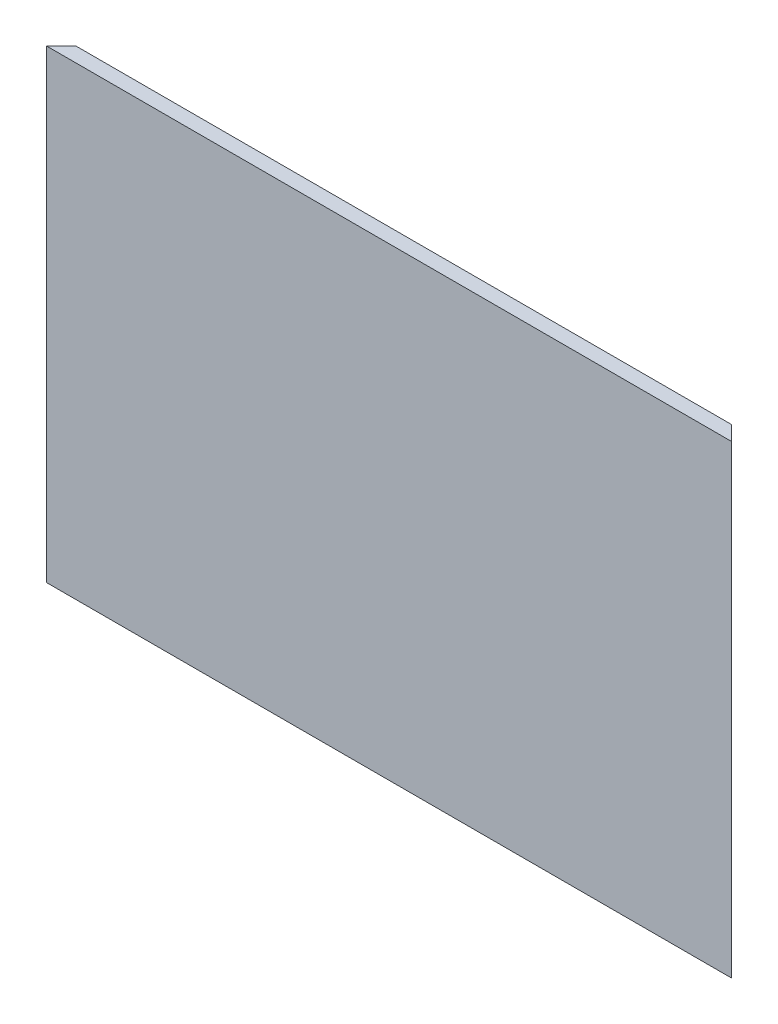
ISO-10303-21;
HEADER;
FILE_DESCRIPTION(('STEP AP214'),'2;1');
FILE_NAME('part.step','',(''),(''),'','','');
FILE_SCHEMA(('AUTOMOTIVE_DESIGN { 1 0 10303 214 1 1 1 1 }'));
ENDSEC;
DATA;
#1=APPLICATION_CONTEXT('core data for automotive mechanical design processes');
#2=APPLICATION_PROTOCOL_DEFINITION('international standard','automotive_design',2000,#1);
#3=PRODUCT_CONTEXT('',#1,'mechanical');
#4=PRODUCT('Part','Part','',(#3));
#5=PRODUCT_RELATED_PRODUCT_CATEGORY('part','',(#4));
#6=PRODUCT_DEFINITION_FORMATION('','',#4);
#7=PRODUCT_DEFINITION_CONTEXT('part definition',#1,'design');
#8=PRODUCT_DEFINITION('design','',#6,#7);
#9=PRODUCT_DEFINITION_SHAPE('','',#8);
#10=(LENGTH_UNIT() NAMED_UNIT(*) SI_UNIT(.MILLI.,.METRE.));
#11=(NAMED_UNIT(*) PLANE_ANGLE_UNIT() SI_UNIT($,.RADIAN.));
#12=(NAMED_UNIT(*) SI_UNIT($,.STERADIAN.) SOLID_ANGLE_UNIT());
#13=UNCERTAINTY_MEASURE_WITH_UNIT(LENGTH_MEASURE(1.E-05),#10,'distance_accuracy_value','');
#14=(GEOMETRIC_REPRESENTATION_CONTEXT(3) GLOBAL_UNCERTAINTY_ASSIGNED_CONTEXT((#13)) GLOBAL_UNIT_ASSIGNED_CONTEXT((#10,
#11,#12)) REPRESENTATION_CONTEXT('',''));
#15=CARTESIAN_POINT('',(0.,0.,0.));
#16=DIRECTION('',(0.,0.,1.));
#17=DIRECTION('',(1.,0.,0.));
#18=AXIS2_PLACEMENT_3D('',#15,#16,#17);
#19=CARTESIAN_POINT('',(70.,95.,1.49999999999999));
#20=DIRECTION('',(0.,0.,-1.));
#21=DIRECTION('',(-1.,0.,0.));
#22=AXIS2_PLACEMENT_3D('',#19,#20,#21);
#23=PLANE('',#22);
#24=DIRECTION('',(1.,0.,0.));
#25=VECTOR('',#24,1.);
#26=CARTESIAN_POINT('',(70.,0.,1.49999999999999));
#27=LINE('',#26,#25);
#28=CARTESIAN_POINT('',(-70.,0.,1.50000000000001));
#29=VERTEX_POINT('',#28);
#30=CARTESIAN_POINT('',(70.,0.,1.49999999999999));
#31=VERTEX_POINT('',#30);
#32=EDGE_CURVE('E79',#29,#31,#27,.T.);
#33=ORIENTED_EDGE('',*,*,#32,.T.);
#34=DIRECTION('',(0.,-1.,0.));
#35=VECTOR('',#34,1.);
#36=CARTESIAN_POINT('',(70.,95.,1.49999999999999));
#37=LINE('',#36,#35);
#38=CARTESIAN_POINT('',(70.,95.,1.49999999999999));
#39=VERTEX_POINT('',#38);
#40=EDGE_CURVE('E40',#39,#31,#37,.T.);
#41=ORIENTED_EDGE('',*,*,#40,.F.);
#42=DIRECTION('',(1.,0.,0.));
#43=VECTOR('',#42,1.);
#44=CARTESIAN_POINT('',(70.,95.,1.49999999999999));
#45=LINE('',#44,#43);
#46=CARTESIAN_POINT('',(-70.,95.,1.50000000000001));
#47=VERTEX_POINT('',#46);
#48=EDGE_CURVE('E88',#47,#39,#45,.T.);
#49=ORIENTED_EDGE('',*,*,#48,.F.);
#50=DIRECTION('',(0.,-1.,0.));
#51=VECTOR('',#50,1.);
#52=CARTESIAN_POINT('',(-70.,95.,1.50000000000001));
#53=LINE('',#52,#51);
#54=EDGE_CURVE('E11',#47,#29,#53,.T.);
#55=ORIENTED_EDGE('',*,*,#54,.T.);
#56=EDGE_LOOP('',(#33,#41,#49,#55));
#57=FACE_BOUND('',#56,.T.);
#58=ADVANCED_FACE('F33',(#57),#23,.F.);
#59=CARTESIAN_POINT('',(70.,95.,-1.50000000000001));
#60=DIRECTION('',(0.,0.,1.));
#61=DIRECTION('',(1.,0.,0.));
#62=AXIS2_PLACEMENT_3D('',#59,#60,#61);
#63=PLANE('',#62);
#64=DIRECTION('',(-1.,0.,0.));
#65=VECTOR('',#64,1.);
#66=CARTESIAN_POINT('',(70.,0.,-1.50000000000001));
#67=LINE('',#66,#65);
#68=CARTESIAN_POINT('',(67.,0.,-1.50000000000001));
#69=VERTEX_POINT('',#68);
#70=CARTESIAN_POINT('',(-67.,0.,-1.49999999999999));
#71=VERTEX_POINT('',#70);
#72=EDGE_CURVE('E83',#69,#71,#67,.T.);
#73=ORIENTED_EDGE('',*,*,#72,.T.);
#74=DIRECTION('',(0.,1.,0.));
#75=VECTOR('',#74,1.);
#76=CARTESIAN_POINT('',(-67.,0.,-1.50000000000001));
#77=LINE('',#76,#75);
#78=CARTESIAN_POINT('',(-67.,95.,-1.50000000000001));
#79=VERTEX_POINT('',#78);
#80=EDGE_CURVE('E47',#71,#79,#77,.T.);
#81=ORIENTED_EDGE('',*,*,#80,.T.);
#82=DIRECTION('',(-1.,0.,0.));
#83=VECTOR('',#82,1.);
#84=CARTESIAN_POINT('',(70.,95.,-1.50000000000001));
#85=LINE('',#84,#83);
#86=CARTESIAN_POINT('',(67.,95.,-1.50000000000001));
#87=VERTEX_POINT('',#86);
#88=EDGE_CURVE('E91',#87,#79,#85,.T.);
#89=ORIENTED_EDGE('',*,*,#88,.F.);
#90=DIRECTION('',(0.,1.,0.));
#91=VECTOR('',#90,1.);
#92=CARTESIAN_POINT('',(67.,0.,-1.50000000000001));
#93=LINE('',#92,#91);
#94=EDGE_CURVE('E84',#69,#87,#93,.T.);
#95=ORIENTED_EDGE('',*,*,#94,.F.);
#96=EDGE_LOOP('',(#73,#81,#89,#95));
#97=FACE_BOUND('',#96,.T.);
#98=ADVANCED_FACE('F104',(#97),#63,.F.);
#99=CARTESIAN_POINT('',(0.,95.,0.));
#100=DIRECTION('',(0.,1.,0.));
#101=DIRECTION('',(0.,0.,1.));
#102=AXIS2_PLACEMENT_3D('',#99,#100,#101);
#103=PLANE('',#102);
#104=DIRECTION('',(0.707106781186542,0.,-0.707106781186553));
#105=VECTOR('',#104,1.);
#106=CARTESIAN_POINT('',(-67.,95.,-1.50000000000001));
#107=LINE('',#106,#105);
#108=EDGE_CURVE('E76',#47,#79,#107,.T.);
#109=ORIENTED_EDGE('',*,*,#108,.F.);
#110=ORIENTED_EDGE('',*,*,#48,.T.);
#111=DIRECTION('',(0.707106781186543,0.,0.707106781186552));
#112=VECTOR('',#111,1.);
#113=CARTESIAN_POINT('',(67.,95.,-1.50000000000001));
#114=LINE('',#113,#112);
#115=EDGE_CURVE('E98',#87,#39,#114,.T.);
#116=ORIENTED_EDGE('',*,*,#115,.F.);
#117=ORIENTED_EDGE('',*,*,#88,.T.);
#118=EDGE_LOOP('',(#109,#110,#116,#117));
#119=FACE_BOUND('',#118,.T.);
#120=ADVANCED_FACE('F106',(#119),#103,.T.);
#121=CARTESIAN_POINT('',(0.,0.,0.));
#122=DIRECTION('',(0.,1.,0.));
#123=DIRECTION('',(0.,0.,1.));
#124=AXIS2_PLACEMENT_3D('',#121,#122,#123);
#125=PLANE('',#124);
#126=ORIENTED_EDGE('',*,*,#32,.F.);
#127=DIRECTION('',(0.707106781186542,0.,-0.707106781186553));
#128=VECTOR('',#127,1.);
#129=CARTESIAN_POINT('',(-67.,0.,-1.50000000000001));
#130=LINE('',#129,#128);
#131=EDGE_CURVE('E69',#29,#71,#130,.T.);
#132=ORIENTED_EDGE('',*,*,#131,.T.);
#133=ORIENTED_EDGE('',*,*,#72,.F.);
#134=DIRECTION('',(0.707106781186543,0.,0.707106781186552));
#135=VECTOR('',#134,1.);
#136=CARTESIAN_POINT('',(67.,0.,-1.50000000000001));
#137=LINE('',#136,#135);
#138=EDGE_CURVE('E81',#69,#31,#137,.T.);
#139=ORIENTED_EDGE('',*,*,#138,.T.);
#140=EDGE_LOOP('',(#126,#132,#133,#139));
#141=FACE_BOUND('',#140,.T.);
#142=ADVANCED_FACE('F80',(#141),#125,.F.);
#143=CARTESIAN_POINT('',(67.,0.,-1.50000000000001));
#144=DIRECTION('',(-0.707106781186552,0.,0.707106781186543));
#145=DIRECTION('',(0.707106781186543,0.,0.707106781186552));
#146=AXIS2_PLACEMENT_3D('',#143,#144,#145);
#147=PLANE('',#146);
#148=ORIENTED_EDGE('',*,*,#115,.T.);
#149=ORIENTED_EDGE('',*,*,#40,.T.);
#150=ORIENTED_EDGE('',*,*,#138,.F.);
#151=ORIENTED_EDGE('',*,*,#94,.T.);
#152=EDGE_LOOP('',(#148,#149,#150,#151));
#153=FACE_BOUND('',#152,.T.);
#154=ADVANCED_FACE('F107',(#153),#147,.F.);
#155=CARTESIAN_POINT('',(-67.,0.,-1.50000000000001));
#156=DIRECTION('',(0.707106781186553,0.,0.707106781186542));
#157=DIRECTION('',(0.707106781186542,0.,-0.707106781186553));
#158=AXIS2_PLACEMENT_3D('',#155,#156,#157);
#159=PLANE('',#158);
#160=ORIENTED_EDGE('',*,*,#108,.T.);
#161=ORIENTED_EDGE('',*,*,#80,.F.);
#162=ORIENTED_EDGE('',*,*,#131,.F.);
#163=ORIENTED_EDGE('',*,*,#54,.F.);
#164=EDGE_LOOP('',(#160,#161,#162,#163));
#165=FACE_BOUND('',#164,.T.);
#166=ADVANCED_FACE('F71',(#165),#159,.F.);
#167=CLOSED_SHELL('',(#58,#98,#120,#142,#154,#166));
#168=MANIFOLD_SOLID_BREP('B2',#167);
#169=ADVANCED_BREP_SHAPE_REPRESENTATION('',(#18,#168),#14);
#170=SHAPE_DEFINITION_REPRESENTATION(#9,#169);
ENDSEC;
END-ISO-10303-21;
